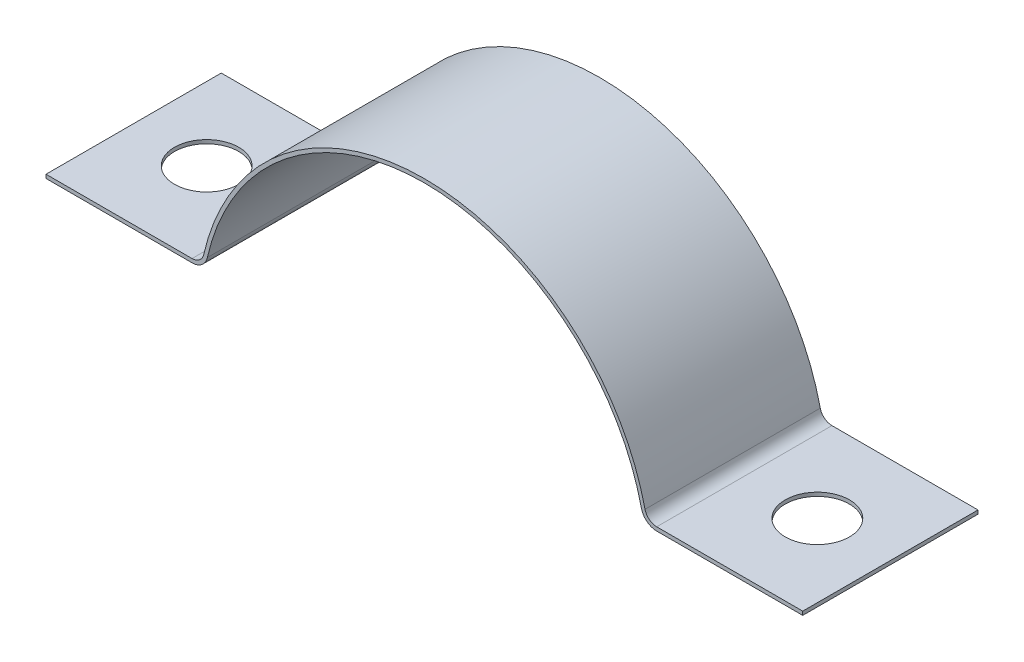
ISO-10303-21;
HEADER;
FILE_DESCRIPTION(('STEP AP214'),'2;1');
FILE_NAME('part.step','',(''),(''),'','','');
FILE_SCHEMA(('AUTOMOTIVE_DESIGN { 1 0 10303 214 1 1 1 1 }'));
ENDSEC;
DATA;
#1=APPLICATION_CONTEXT('core data for automotive mechanical design processes');
#2=APPLICATION_PROTOCOL_DEFINITION('international standard','automotive_design',2000,#1);
#3=PRODUCT_CONTEXT('',#1,'mechanical');
#4=PRODUCT('Part','Part','',(#3));
#5=PRODUCT_RELATED_PRODUCT_CATEGORY('part','',(#4));
#6=PRODUCT_DEFINITION_FORMATION('','',#4);
#7=PRODUCT_DEFINITION_CONTEXT('part definition',#1,'design');
#8=PRODUCT_DEFINITION('design','',#6,#7);
#9=PRODUCT_DEFINITION_SHAPE('','',#8);
#10=(LENGTH_UNIT() NAMED_UNIT(*) SI_UNIT(.MILLI.,.METRE.));
#11=(NAMED_UNIT(*) PLANE_ANGLE_UNIT() SI_UNIT($,.RADIAN.));
#12=(NAMED_UNIT(*) SI_UNIT($,.STERADIAN.) SOLID_ANGLE_UNIT());
#13=UNCERTAINTY_MEASURE_WITH_UNIT(LENGTH_MEASURE(1.E-05),#10,'distance_accuracy_value','');
#14=(GEOMETRIC_REPRESENTATION_CONTEXT(3) GLOBAL_UNCERTAINTY_ASSIGNED_CONTEXT((#13)) GLOBAL_UNIT_ASSIGNED_CONTEXT((#10,
#11,#12)) REPRESENTATION_CONTEXT('',''));
#15=CARTESIAN_POINT('',(0.,0.,0.));
#16=DIRECTION('',(0.,0.,1.));
#17=DIRECTION('',(1.,0.,0.));
#18=AXIS2_PLACEMENT_3D('',#15,#16,#17);
#19=CARTESIAN_POINT('',(-888.256864207504,-920.654503260457,-525.255431386205));
#20=DIRECTION('',(1.,0.,0.));
#21=DIRECTION('',(0.,0.,-1.));
#22=AXIS2_PLACEMENT_3D('',#19,#20,#21);
#23=PLANE('',#22);
#24=DIRECTION('',(0.,1.,0.));
#25=VECTOR('',#24,1.);
#26=CARTESIAN_POINT('',(-888.256864207504,-920.654503260457,-555.255431386205));
#27=LINE('',#26,#25);
#28=CARTESIAN_POINT('',(-888.256864207504,-920.654503260457,-555.255431386205));
#29=VERTEX_POINT('',#28);
#30=CARTESIAN_POINT('',(-888.256864207504,-920.019503260457,-555.255431386205));
#31=VERTEX_POINT('',#30);
#32=EDGE_CURVE('E80',#29,#31,#27,.T.);
#33=ORIENTED_EDGE('',*,*,#32,.F.);
#34=DIRECTION('',(0.,0.,1.));
#35=VECTOR('',#34,1.);
#36=CARTESIAN_POINT('',(-888.256864207504,-920.654503260457,-525.255431386205));
#37=LINE('',#36,#35);
#38=CARTESIAN_POINT('',(-888.256864207504,-920.654503260457,-525.255431386205));
#39=VERTEX_POINT('',#38);
#40=EDGE_CURVE('E160',#29,#39,#37,.T.);
#41=ORIENTED_EDGE('',*,*,#40,.T.);
#42=DIRECTION('',(0.,1.,0.));
#43=VECTOR('',#42,1.);
#44=CARTESIAN_POINT('',(-888.256864207504,-920.654503260457,-525.255431386205));
#45=LINE('',#44,#43);
#46=CARTESIAN_POINT('',(-888.256864207504,-920.019503260457,-525.255431386205));
#47=VERTEX_POINT('',#46);
#48=EDGE_CURVE('E185',#47,#39,#45,.F.);
#49=ORIENTED_EDGE('',*,*,#48,.F.);
#50=DIRECTION('',(0.,0.,-1.));
#51=VECTOR('',#50,1.);
#52=CARTESIAN_POINT('',(-888.256864207504,-920.019503260457,-525.255431386205));
#53=LINE('',#52,#51);
#54=EDGE_CURVE('E166',#47,#31,#53,.T.);
#55=ORIENTED_EDGE('',*,*,#54,.T.);
#56=EDGE_LOOP('',(#33,#41,#49,#55));
#57=FACE_BOUND('',#56,.T.);
#58=ADVANCED_FACE('F17',(#57),#23,.F.);
#59=CARTESIAN_POINT('',(-875.756864207504,-923.901103250107,-540.255431386205));
#60=DIRECTION('',(0.,1.,0.));
#61=DIRECTION('',(-1.,0.,0.));
#62=AXIS2_PLACEMENT_3D('',#59,#60,#61);
#63=CYLINDRICAL_SURFACE('',#62,5.5);
#64=CARTESIAN_POINT('',(-875.756864207504,-920.019503260457,-540.255431386205));
#65=DIRECTION('',(0.,1.,0.));
#66=DIRECTION('',(-1.,0.,0.));
#67=AXIS2_PLACEMENT_3D('',#64,#65,#66);
#68=CIRCLE('',#67,5.5);
#69=CARTESIAN_POINT('',(-881.256864207504,-920.019503260457,-540.255431386205));
#70=VERTEX_POINT('',#69);
#71=EDGE_CURVE('E20',#70,#70,#68,.T.);
#72=ORIENTED_EDGE('',*,*,#71,.T.);
#73=EDGE_LOOP('',(#72));
#74=FACE_BOUND('',#73,.T.);
#75=CARTESIAN_POINT('',(-875.756864207504,-920.654503260457,-540.255431386205));
#76=DIRECTION('',(0.,1.,0.));
#77=DIRECTION('',(-1.,0.,0.));
#78=AXIS2_PLACEMENT_3D('',#75,#76,#77);
#79=CIRCLE('',#78,5.5);
#80=CARTESIAN_POINT('',(-881.256864207504,-920.654503260457,-540.255431386205));
#81=VERTEX_POINT('',#80);
#82=EDGE_CURVE('E158',#81,#81,#79,.F.);
#83=ORIENTED_EDGE('',*,*,#82,.T.);
#84=EDGE_LOOP('',(#83));
#85=FACE_BOUND('',#84,.T.);
#86=ADVANCED_FACE('F280',(#74,#85),#63,.F.);
#87=CARTESIAN_POINT('',(-758.721831015473,-920.019503260457,-525.255431386205));
#88=DIRECTION('',(-1.,0.,0.));
#89=DIRECTION('',(0.,0.,1.));
#90=AXIS2_PLACEMENT_3D('',#87,#88,#89);
#91=PLANE('',#90);
#92=DIRECTION('',(0.,1.,0.));
#93=VECTOR('',#92,1.);
#94=CARTESIAN_POINT('',(-758.721831015473,-920.019503260457,-555.255431386205));
#95=LINE('',#94,#93);
#96=CARTESIAN_POINT('',(-758.721831015473,-920.019503260457,-555.255431386205));
#97=VERTEX_POINT('',#96);
#98=CARTESIAN_POINT('',(-758.721831015473,-920.654503260457,-555.255431386205));
#99=VERTEX_POINT('',#98);
#100=EDGE_CURVE('E171',#97,#99,#95,.F.);
#101=ORIENTED_EDGE('',*,*,#100,.F.);
#102=DIRECTION('',(0.,0.,-1.));
#103=VECTOR('',#102,1.);
#104=CARTESIAN_POINT('',(-758.721831015473,-920.019503260457,-525.255431386205));
#105=LINE('',#104,#103);
#106=CARTESIAN_POINT('',(-758.721831015473,-920.019503260457,-525.255431386205));
#107=VERTEX_POINT('',#106);
#108=EDGE_CURVE('E154',#97,#107,#105,.F.);
#109=ORIENTED_EDGE('',*,*,#108,.T.);
#110=DIRECTION('',(0.,1.,0.));
#111=VECTOR('',#110,1.);
#112=CARTESIAN_POINT('',(-758.721831015473,-920.019503260457,-525.255431386205));
#113=LINE('',#112,#111);
#114=CARTESIAN_POINT('',(-758.721831015473,-920.654503260457,-525.255431386205));
#115=VERTEX_POINT('',#114);
#116=EDGE_CURVE('E177',#115,#107,#113,.T.);
#117=ORIENTED_EDGE('',*,*,#116,.F.);
#118=DIRECTION('',(0.,0.,1.));
#119=VECTOR('',#118,1.);
#120=CARTESIAN_POINT('',(-758.721831015473,-920.654503260457,-525.255431386205));
#121=LINE('',#120,#119);
#122=EDGE_CURVE('E239',#115,#99,#121,.F.);
#123=ORIENTED_EDGE('',*,*,#122,.T.);
#124=EDGE_LOOP('',(#101,#109,#117,#123));
#125=FACE_BOUND('',#124,.T.);
#126=ADVANCED_FACE('F261',(#125),#91,.F.);
#127=CARTESIAN_POINT('',(-771.221831015473,-923.901103250107,-540.255431386205));
#128=DIRECTION('',(0.,1.,0.));
#129=DIRECTION('',(-1.,0.,0.));
#130=AXIS2_PLACEMENT_3D('',#127,#128,#129);
#131=CYLINDRICAL_SURFACE('',#130,5.5);
#132=CARTESIAN_POINT('',(-771.221831015473,-920.019503260457,-540.255431386205));
#133=DIRECTION('',(0.,1.,0.));
#134=DIRECTION('',(-1.,0.,0.));
#135=AXIS2_PLACEMENT_3D('',#132,#133,#134);
#136=CIRCLE('',#135,5.5);
#137=CARTESIAN_POINT('',(-776.721831015473,-920.019503260457,-540.255431386205));
#138=VERTEX_POINT('',#137);
#139=EDGE_CURVE('E150',#138,#138,#136,.T.);
#140=ORIENTED_EDGE('',*,*,#139,.T.);
#141=EDGE_LOOP('',(#140));
#142=FACE_BOUND('',#141,.T.);
#143=CARTESIAN_POINT('',(-771.221831015473,-920.654503260457,-540.255431386205));
#144=DIRECTION('',(0.,1.,0.));
#145=DIRECTION('',(-1.,0.,0.));
#146=AXIS2_PLACEMENT_3D('',#143,#144,#145);
#147=CIRCLE('',#146,5.5);
#148=CARTESIAN_POINT('',(-776.721831015473,-920.654503260457,-540.255431386205));
#149=VERTEX_POINT('',#148);
#150=EDGE_CURVE('E155',#149,#149,#147,.F.);
#151=ORIENTED_EDGE('',*,*,#150,.T.);
#152=EDGE_LOOP('',(#151));
#153=FACE_BOUND('',#152,.T.);
#154=ADVANCED_FACE('F318',(#142,#153),#131,.F.);
#155=CARTESIAN_POINT('',(-888.256864207504,-920.019503260457,-525.255431386205));
#156=DIRECTION('',(0.,-1.,0.));
#157=DIRECTION('',(0.,0.,-1.));
#158=AXIS2_PLACEMENT_3D('',#155,#156,#157);
#159=PLANE('',#158);
#160=ORIENTED_EDGE('',*,*,#71,.F.);
#161=EDGE_LOOP('',(#160));
#162=FACE_BOUND('',#161,.T.);
#163=DIRECTION('',(1.,0.,0.));
#164=VECTOR('',#163,1.);
#165=CARTESIAN_POINT('',(-888.256864207504,-920.019503260457,-555.255431386205));
#166=LINE('',#165,#164);
#167=CARTESIAN_POINT('',(-863.256864207504,-920.019503260457,-555.255431386205));
#168=VERTEX_POINT('',#167);
#169=EDGE_CURVE('E226',#168,#31,#166,.F.);
#170=ORIENTED_EDGE('',*,*,#169,.T.);
#171=ORIENTED_EDGE('',*,*,#54,.F.);
#172=DIRECTION('',(1.,0.,0.));
#173=VECTOR('',#172,1.);
#174=CARTESIAN_POINT('',(-875.756864207504,-920.019503260457,-525.255431386205));
#175=LINE('',#174,#173);
#176=CARTESIAN_POINT('',(-863.256864207504,-920.019503260457,-525.255431386205));
#177=VERTEX_POINT('',#176);
#178=EDGE_CURVE('E133',#177,#47,#175,.F.);
#179=ORIENTED_EDGE('',*,*,#178,.F.);
#180=DIRECTION('',(0.,0.,1.));
#181=VECTOR('',#180,1.);
#182=CARTESIAN_POINT('',(-863.256864207504,-920.019503260456,-525.255431386205));
#183=LINE('',#182,#181);
#184=EDGE_CURVE('E140',#177,#168,#183,.F.);
#185=ORIENTED_EDGE('',*,*,#184,.T.);
#186=EDGE_LOOP('',(#170,#171,#179,#185));
#187=FACE_BOUND('',#186,.T.);
#188=ADVANCED_FACE('F277',(#162,#187),#159,.F.);
#189=CARTESIAN_POINT('',(-863.256864207504,-920.654503260457,-525.255431386205));
#190=DIRECTION('',(0.,1.,0.));
#191=DIRECTION('',(0.,0.,1.));
#192=AXIS2_PLACEMENT_3D('',#189,#190,#191);
#193=PLANE('',#192);
#194=ORIENTED_EDGE('',*,*,#82,.F.);
#195=EDGE_LOOP('',(#194));
#196=FACE_BOUND('',#195,.T.);
#197=DIRECTION('',(1.,0.,0.));
#198=VECTOR('',#197,1.);
#199=CARTESIAN_POINT('',(-888.256864207504,-920.654503260457,-555.255431386205));
#200=LINE('',#199,#198);
#201=CARTESIAN_POINT('',(-863.256864207504,-920.654503260457,-555.255431386205));
#202=VERTEX_POINT('',#201);
#203=EDGE_CURVE('E70',#29,#202,#200,.T.);
#204=ORIENTED_EDGE('',*,*,#203,.T.);
#205=DIRECTION('',(0.,0.,1.));
#206=VECTOR('',#205,1.);
#207=CARTESIAN_POINT('',(-863.256864207504,-920.654503260456,-525.255431386205));
#208=LINE('',#207,#206);
#209=CARTESIAN_POINT('',(-863.256864207504,-920.654503260457,-525.255431386205));
#210=VERTEX_POINT('',#209);
#211=EDGE_CURVE('E103',#210,#202,#208,.F.);
#212=ORIENTED_EDGE('',*,*,#211,.F.);
#213=DIRECTION('',(1.,0.,0.));
#214=VECTOR('',#213,1.);
#215=CARTESIAN_POINT('',(-875.756864207504,-920.654503260457,-525.255431386205));
#216=LINE('',#215,#214);
#217=EDGE_CURVE('E131',#39,#210,#216,.T.);
#218=ORIENTED_EDGE('',*,*,#217,.F.);
#219=ORIENTED_EDGE('',*,*,#40,.F.);
#220=EDGE_LOOP('',(#204,#212,#218,#219));
#221=FACE_BOUND('',#220,.T.);
#222=ADVANCED_FACE('F312',(#196,#221),#193,.F.);
#223=CARTESIAN_POINT('',(-863.256864207504,-917.970422543779,-525.255431386205));
#224=DIRECTION('',(0.,0.,1.));
#225=DIRECTION('',(1.,0.,0.));
#226=AXIS2_PLACEMENT_3D('',#223,#224,#225);
#227=CYLINDRICAL_SURFACE('',#226,2.68408071667733);
#228=DIRECTION('',(0.,0.,1.));
#229=VECTOR('',#228,1.);
#230=CARTESIAN_POINT('',(-860.639685578739,-918.565960383698,-525.255431386205));
#231=LINE('',#230,#229);
#232=CARTESIAN_POINT('',(-860.639685578739,-918.565960383698,-555.255431386205));
#233=VERTEX_POINT('',#232);
#234=CARTESIAN_POINT('',(-860.639685578739,-918.565960383698,-525.255431386205));
#235=VERTEX_POINT('',#234);
#236=EDGE_CURVE('E108',#233,#235,#231,.T.);
#237=ORIENTED_EDGE('',*,*,#236,.T.);
#238=CARTESIAN_POINT('',(-863.256864207504,-917.970422543779,-525.255431386205));
#239=DIRECTION('',(0.,0.,1.));
#240=DIRECTION('',(1.,0.,0.));
#241=AXIS2_PLACEMENT_3D('',#238,#239,#240);
#242=CIRCLE('',#241,2.68408071667733);
#243=EDGE_CURVE('E112',#210,#235,#242,.T.);
#244=ORIENTED_EDGE('',*,*,#243,.F.);
#245=ORIENTED_EDGE('',*,*,#211,.T.);
#246=CARTESIAN_POINT('',(-863.256864207504,-917.970422543779,-555.255431386205));
#247=DIRECTION('',(0.,0.,1.));
#248=DIRECTION('',(1.,0.,0.));
#249=AXIS2_PLACEMENT_3D('',#246,#247,#248);
#250=CIRCLE('',#249,2.68408071667733);
#251=EDGE_CURVE('E115',#202,#233,#250,.T.);
#252=ORIENTED_EDGE('',*,*,#251,.T.);
#253=EDGE_LOOP('',(#237,#244,#245,#252));
#254=FACE_BOUND('',#253,.T.);
#255=ADVANCED_FACE('F110',(#254),#227,.T.);
#256=CARTESIAN_POINT('',(-823.489347611488,-927.019503363955,-525.255431386205));
#257=DIRECTION('',(0.,0.,1.));
#258=DIRECTION('',(1.,0.,0.));
#259=AXIS2_PLACEMENT_3D('',#256,#257,#258);
#260=CYLINDRICAL_SURFACE('',#259,38.1);
#261=CARTESIAN_POINT('',(-823.489347611488,-927.019503363955,-555.255431386205));
#262=DIRECTION('',(0.,0.,1.));
#263=DIRECTION('',(1.,0.,0.));
#264=AXIS2_PLACEMENT_3D('',#261,#262,#263);
#265=CIRCLE('',#264,38.1);
#266=CARTESIAN_POINT('',(-786.339009644238,-918.565960383698,-555.255431386205));
#267=VERTEX_POINT('',#266);
#268=EDGE_CURVE('E147',#233,#267,#265,.F.);
#269=ORIENTED_EDGE('',*,*,#268,.T.);
#270=DIRECTION('',(0.,0.,1.));
#271=VECTOR('',#270,1.);
#272=CARTESIAN_POINT('',(-786.339009644238,-918.565960383698,-525.255431386205));
#273=LINE('',#272,#271);
#274=CARTESIAN_POINT('',(-786.339009644238,-918.565960383698,-525.255431386205));
#275=VERTEX_POINT('',#274);
#276=EDGE_CURVE('E118',#275,#267,#273,.F.);
#277=ORIENTED_EDGE('',*,*,#276,.F.);
#278=CARTESIAN_POINT('',(-823.489347611488,-927.019503363955,-525.255431386205));
#279=DIRECTION('',(0.,0.,1.));
#280=DIRECTION('',(1.,0.,0.));
#281=AXIS2_PLACEMENT_3D('',#278,#279,#280);
#282=CIRCLE('',#281,38.1);
#283=EDGE_CURVE('E121',#235,#275,#282,.F.);
#284=ORIENTED_EDGE('',*,*,#283,.F.);
#285=ORIENTED_EDGE('',*,*,#236,.F.);
#286=EDGE_LOOP('',(#269,#277,#284,#285));
#287=FACE_BOUND('',#286,.T.);
#288=ADVANCED_FACE('F122',(#287),#260,.F.);
#289=CARTESIAN_POINT('',(-783.721831015473,-917.970422543779,-525.255431386205));
#290=DIRECTION('',(0.,0.,1.));
#291=DIRECTION('',(1.,0.,0.));
#292=AXIS2_PLACEMENT_3D('',#289,#290,#291);
#293=CYLINDRICAL_SURFACE('',#292,2.68408071667733);
#294=DIRECTION('',(0.,0.,1.));
#295=VECTOR('',#294,1.);
#296=CARTESIAN_POINT('',(-783.721831015473,-920.654503260457,-525.255431386205));
#297=LINE('',#296,#295);
#298=CARTESIAN_POINT('',(-783.721831015473,-920.654503260457,-555.255431386205));
#299=VERTEX_POINT('',#298);
#300=CARTESIAN_POINT('',(-783.721831015473,-920.654503260457,-525.255431386205));
#301=VERTEX_POINT('',#300);
#302=EDGE_CURVE('E157',#299,#301,#297,.T.);
#303=ORIENTED_EDGE('',*,*,#302,.T.);
#304=CARTESIAN_POINT('',(-783.721831015473,-917.970422543779,-525.255431386205));
#305=DIRECTION('',(0.,0.,1.));
#306=DIRECTION('',(1.,0.,0.));
#307=AXIS2_PLACEMENT_3D('',#304,#305,#306);
#308=CIRCLE('',#307,2.68408071667733);
#309=EDGE_CURVE('E127',#275,#301,#308,.T.);
#310=ORIENTED_EDGE('',*,*,#309,.F.);
#311=ORIENTED_EDGE('',*,*,#276,.T.);
#312=CARTESIAN_POINT('',(-783.721831015473,-917.970422543779,-555.255431386205));
#313=DIRECTION('',(0.,0.,1.));
#314=DIRECTION('',(1.,0.,0.));
#315=AXIS2_PLACEMENT_3D('',#312,#313,#314);
#316=CIRCLE('',#315,2.68408071667733);
#317=EDGE_CURVE('E144',#267,#299,#316,.T.);
#318=ORIENTED_EDGE('',*,*,#317,.T.);
#319=EDGE_LOOP('',(#303,#310,#311,#318));
#320=FACE_BOUND('',#319,.T.);
#321=ADVANCED_FACE('F246',(#320),#293,.T.);
#322=CARTESIAN_POINT('',(-758.721831015473,-920.654503260457,-525.255431386205));
#323=DIRECTION('',(0.,1.,0.));
#324=DIRECTION('',(-1.,0.,0.));
#325=AXIS2_PLACEMENT_3D('',#322,#323,#324);
#326=PLANE('',#325);
#327=ORIENTED_EDGE('',*,*,#150,.F.);
#328=EDGE_LOOP('',(#327));
#329=FACE_BOUND('',#328,.T.);
#330=DIRECTION('',(1.,0.,0.));
#331=VECTOR('',#330,1.);
#332=CARTESIAN_POINT('',(-888.256864207504,-920.654503260457,-555.255431386205));
#333=LINE('',#332,#331);
#334=EDGE_CURVE('E146',#299,#99,#333,.T.);
#335=ORIENTED_EDGE('',*,*,#334,.T.);
#336=ORIENTED_EDGE('',*,*,#122,.F.);
#337=DIRECTION('',(1.,0.,0.));
#338=VECTOR('',#337,1.);
#339=CARTESIAN_POINT('',(-875.756864207504,-920.654503260457,-525.255431386205));
#340=LINE('',#339,#338);
#341=EDGE_CURVE('E198',#301,#115,#340,.T.);
#342=ORIENTED_EDGE('',*,*,#341,.F.);
#343=ORIENTED_EDGE('',*,*,#302,.F.);
#344=EDGE_LOOP('',(#335,#336,#342,#343));
#345=FACE_BOUND('',#344,.T.);
#346=ADVANCED_FACE('F255',(#329,#345),#326,.F.);
#347=CARTESIAN_POINT('',(-783.721831015473,-920.019503260457,-525.255431386205));
#348=DIRECTION('',(0.,-1.,0.));
#349=DIRECTION('',(0.,0.,-1.));
#350=AXIS2_PLACEMENT_3D('',#347,#348,#349);
#351=PLANE('',#350);
#352=ORIENTED_EDGE('',*,*,#139,.F.);
#353=EDGE_LOOP('',(#352));
#354=FACE_BOUND('',#353,.T.);
#355=DIRECTION('',(1.,0.,0.));
#356=VECTOR('',#355,1.);
#357=CARTESIAN_POINT('',(-888.256864207504,-920.019503260457,-555.255431386205));
#358=LINE('',#357,#356);
#359=CARTESIAN_POINT('',(-783.721831015473,-920.019503260457,-555.255431386205));
#360=VERTEX_POINT('',#359);
#361=EDGE_CURVE('E143',#97,#360,#358,.F.);
#362=ORIENTED_EDGE('',*,*,#361,.T.);
#363=DIRECTION('',(0.,0.,1.));
#364=VECTOR('',#363,1.);
#365=CARTESIAN_POINT('',(-783.721831015473,-920.019503260456,-525.255431386205));
#366=LINE('',#365,#364);
#367=CARTESIAN_POINT('',(-783.721831015473,-920.019503260457,-525.255431386205));
#368=VERTEX_POINT('',#367);
#369=EDGE_CURVE('E153',#360,#368,#366,.T.);
#370=ORIENTED_EDGE('',*,*,#369,.T.);
#371=DIRECTION('',(1.,0.,0.));
#372=VECTOR('',#371,1.);
#373=CARTESIAN_POINT('',(-875.756864207504,-920.019503260457,-525.255431386205));
#374=LINE('',#373,#372);
#375=EDGE_CURVE('E197',#107,#368,#374,.F.);
#376=ORIENTED_EDGE('',*,*,#375,.F.);
#377=ORIENTED_EDGE('',*,*,#108,.F.);
#378=EDGE_LOOP('',(#362,#370,#376,#377));
#379=FACE_BOUND('',#378,.T.);
#380=ADVANCED_FACE('F266',(#354,#379),#351,.F.);
#381=CARTESIAN_POINT('',(-783.721831015473,-917.970422543779,-525.255431386205));
#382=DIRECTION('',(0.,0.,1.));
#383=DIRECTION('',(1.,0.,0.));
#384=AXIS2_PLACEMENT_3D('',#381,#382,#383);
#385=CYLINDRICAL_SURFACE('',#384,2.04908071667732);
#386=CARTESIAN_POINT('',(-783.721831015473,-917.970422543779,-555.255431386205));
#387=DIRECTION('',(0.,0.,1.));
#388=DIRECTION('',(1.,0.,0.));
#389=AXIS2_PLACEMENT_3D('',#386,#387,#388);
#390=CIRCLE('',#389,2.04908071667732);
#391=CARTESIAN_POINT('',(-785.719837344783,-918.425068000694,-555.255431386205));
#392=VERTEX_POINT('',#391);
#393=EDGE_CURVE('E141',#360,#392,#390,.F.);
#394=ORIENTED_EDGE('',*,*,#393,.T.);
#395=DIRECTION('',(0.,0.,1.));
#396=VECTOR('',#395,1.);
#397=CARTESIAN_POINT('',(-785.719837344783,-918.425068000694,-525.255431386205));
#398=LINE('',#397,#396);
#399=CARTESIAN_POINT('',(-785.719837344783,-918.425068000694,-525.255431386205));
#400=VERTEX_POINT('',#399);
#401=EDGE_CURVE('E194',#400,#392,#398,.F.);
#402=ORIENTED_EDGE('',*,*,#401,.F.);
#403=CARTESIAN_POINT('',(-783.721831015473,-917.970422543779,-525.255431386205));
#404=DIRECTION('',(0.,0.,1.));
#405=DIRECTION('',(1.,0.,0.));
#406=AXIS2_PLACEMENT_3D('',#403,#404,#405);
#407=CIRCLE('',#406,2.04908071667732);
#408=EDGE_CURVE('E195',#368,#400,#407,.F.);
#409=ORIENTED_EDGE('',*,*,#408,.F.);
#410=ORIENTED_EDGE('',*,*,#369,.F.);
#411=EDGE_LOOP('',(#394,#402,#409,#410));
#412=FACE_BOUND('',#411,.T.);
#413=ADVANCED_FACE('F270',(#412),#385,.F.);
#414=CARTESIAN_POINT('',(-888.256864207504,-920.019503260457,-555.255431386205));
#415=DIRECTION('',(0.,0.,1.));
#416=DIRECTION('',(1.,0.,0.));
#417=AXIS2_PLACEMENT_3D('',#414,#415,#416);
#418=PLANE('',#417);
#419=ORIENTED_EDGE('',*,*,#361,.F.);
#420=ORIENTED_EDGE('',*,*,#100,.T.);
#421=ORIENTED_EDGE('',*,*,#334,.F.);
#422=ORIENTED_EDGE('',*,*,#317,.F.);
#423=ORIENTED_EDGE('',*,*,#268,.F.);
#424=ORIENTED_EDGE('',*,*,#251,.F.);
#425=ORIENTED_EDGE('',*,*,#203,.F.);
#426=ORIENTED_EDGE('',*,*,#32,.T.);
#427=ORIENTED_EDGE('',*,*,#169,.F.);
#428=CARTESIAN_POINT('',(-863.256864207504,-917.970422543779,-555.255431386205));
#429=DIRECTION('',(0.,0.,1.));
#430=DIRECTION('',(1.,0.,0.));
#431=AXIS2_PLACEMENT_3D('',#428,#429,#430);
#432=CIRCLE('',#431,2.04908071667733);
#433=CARTESIAN_POINT('',(-861.258857878193,-918.425068000694,-555.255431386205));
#434=VERTEX_POINT('',#433);
#435=EDGE_CURVE('E138',#168,#434,#432,.T.);
#436=ORIENTED_EDGE('',*,*,#435,.T.);
#437=CARTESIAN_POINT('',(-823.489347611488,-927.019503363955,-555.255431386205));
#438=DIRECTION('',(0.,0.,1.));
#439=DIRECTION('',(1.,0.,0.));
#440=AXIS2_PLACEMENT_3D('',#437,#438,#439);
#441=CIRCLE('',#440,38.735);
#442=EDGE_CURVE('E191',#392,#434,#441,.T.);
#443=ORIENTED_EDGE('',*,*,#442,.F.);
#444=ORIENTED_EDGE('',*,*,#393,.F.);
#445=EDGE_LOOP('',(#419,#420,#421,#422,#423,#424,#425,#426,#427,#436,#443,#444));
#446=FACE_BOUND('',#445,.T.);
#447=ADVANCED_FACE('F251',(#446),#418,.F.);
#448=CARTESIAN_POINT('',(-863.256864207504,-917.970422543779,-525.255431386205));
#449=DIRECTION('',(0.,0.,1.));
#450=DIRECTION('',(1.,0.,0.));
#451=AXIS2_PLACEMENT_3D('',#448,#449,#450);
#452=CYLINDRICAL_SURFACE('',#451,2.04908071667733);
#453=ORIENTED_EDGE('',*,*,#435,.F.);
#454=ORIENTED_EDGE('',*,*,#184,.F.);
#455=CARTESIAN_POINT('',(-863.256864207504,-917.970422543779,-525.255431386205));
#456=DIRECTION('',(0.,0.,1.));
#457=DIRECTION('',(1.,0.,0.));
#458=AXIS2_PLACEMENT_3D('',#455,#456,#457);
#459=CIRCLE('',#458,2.04908071667733);
#460=CARTESIAN_POINT('',(-861.258857878193,-918.425068000694,-525.255431386205));
#461=VERTEX_POINT('',#460);
#462=EDGE_CURVE('E35',#461,#177,#459,.F.);
#463=ORIENTED_EDGE('',*,*,#462,.F.);
#464=DIRECTION('',(0.,0.,1.));
#465=VECTOR('',#464,1.);
#466=CARTESIAN_POINT('',(-861.258857878193,-918.425068000694,-525.255431386205));
#467=LINE('',#466,#465);
#468=EDGE_CURVE('E26',#434,#461,#467,.T.);
#469=ORIENTED_EDGE('',*,*,#468,.F.);
#470=EDGE_LOOP('',(#453,#454,#463,#469));
#471=FACE_BOUND('',#470,.T.);
#472=ADVANCED_FACE('F291',(#471),#452,.F.);
#473=CARTESIAN_POINT('',(-875.756864207504,-915.519503260457,-525.255431386205));
#474=DIRECTION('',(0.,0.,1.));
#475=DIRECTION('',(1.,0.,0.));
#476=AXIS2_PLACEMENT_3D('',#473,#474,#475);
#477=PLANE('',#476);
#478=ORIENTED_EDGE('',*,*,#375,.T.);
#479=ORIENTED_EDGE('',*,*,#408,.T.);
#480=CARTESIAN_POINT('',(-823.489347611488,-927.019503363955,-525.255431386205));
#481=DIRECTION('',(0.,0.,1.));
#482=DIRECTION('',(1.,0.,0.));
#483=AXIS2_PLACEMENT_3D('',#480,#481,#482);
#484=CIRCLE('',#483,38.735);
#485=EDGE_CURVE('E11',#461,#400,#484,.F.);
#486=ORIENTED_EDGE('',*,*,#485,.F.);
#487=ORIENTED_EDGE('',*,*,#462,.T.);
#488=ORIENTED_EDGE('',*,*,#178,.T.);
#489=ORIENTED_EDGE('',*,*,#48,.T.);
#490=ORIENTED_EDGE('',*,*,#217,.T.);
#491=ORIENTED_EDGE('',*,*,#243,.T.);
#492=ORIENTED_EDGE('',*,*,#283,.T.);
#493=ORIENTED_EDGE('',*,*,#309,.T.);
#494=ORIENTED_EDGE('',*,*,#341,.T.);
#495=ORIENTED_EDGE('',*,*,#116,.T.);
#496=EDGE_LOOP('',(#478,#479,#486,#487,#488,#489,#490,#491,#492,#493,#494,#495));
#497=FACE_BOUND('',#496,.T.);
#498=ADVANCED_FACE('F130',(#497),#477,.T.);
#499=CARTESIAN_POINT('',(-823.489347611488,-927.019503363955,-525.255431386205));
#500=DIRECTION('',(0.,0.,1.));
#501=DIRECTION('',(1.,0.,0.));
#502=AXIS2_PLACEMENT_3D('',#499,#500,#501);
#503=CYLINDRICAL_SURFACE('',#502,38.735);
#504=ORIENTED_EDGE('',*,*,#468,.T.);
#505=ORIENTED_EDGE('',*,*,#485,.T.);
#506=ORIENTED_EDGE('',*,*,#401,.T.);
#507=ORIENTED_EDGE('',*,*,#442,.T.);
#508=EDGE_LOOP('',(#504,#505,#506,#507));
#509=FACE_BOUND('',#508,.T.);
#510=ADVANCED_FACE('F273',(#509),#503,.T.);
#511=CLOSED_SHELL('',(#58,#86,#126,#154,#188,#222,#255,#288,#321,#346,#380,#413,#447,#472,#498,#510));
#512=MANIFOLD_SOLID_BREP('B1',#511);
#513=ADVANCED_BREP_SHAPE_REPRESENTATION('',(#18,#512),#14);
#514=SHAPE_DEFINITION_REPRESENTATION(#9,#513);
ENDSEC;
END-ISO-10303-21;
